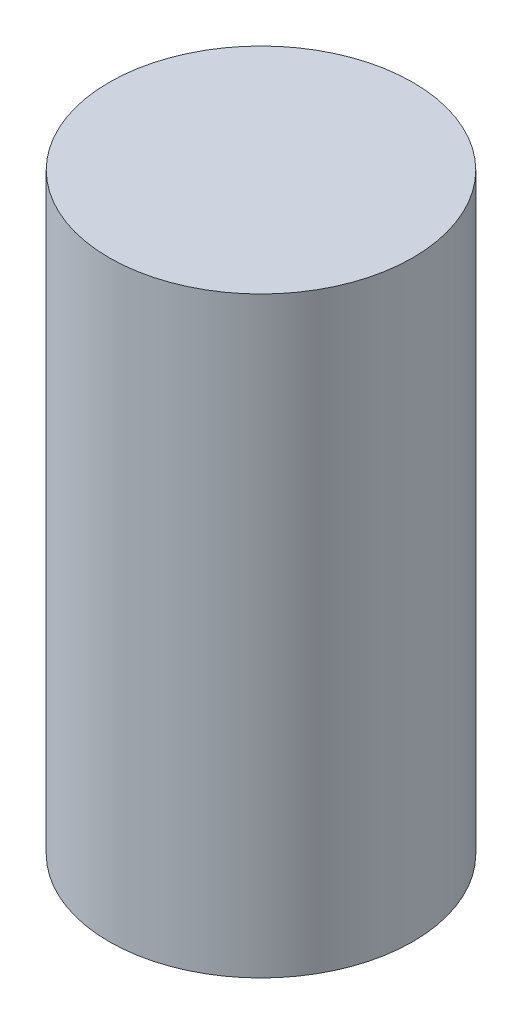
ISO-10303-21;
HEADER;
FILE_DESCRIPTION(('STEP AP214'),'2;1');
FILE_NAME('part.step','',(''),(''),'','','');
FILE_SCHEMA(('AUTOMOTIVE_DESIGN { 1 0 10303 214 1 1 1 1 }'));
ENDSEC;
DATA;
#1=APPLICATION_CONTEXT('core data for automotive mechanical design processes');
#2=APPLICATION_PROTOCOL_DEFINITION('international standard','automotive_design',2000,#1);
#3=PRODUCT_CONTEXT('',#1,'mechanical');
#4=PRODUCT('Part','Part','',(#3));
#5=PRODUCT_RELATED_PRODUCT_CATEGORY('part','',(#4));
#6=PRODUCT_DEFINITION_FORMATION('','',#4);
#7=PRODUCT_DEFINITION_CONTEXT('part definition',#1,'design');
#8=PRODUCT_DEFINITION('design','',#6,#7);
#9=PRODUCT_DEFINITION_SHAPE('','',#8);
#10=(LENGTH_UNIT() NAMED_UNIT(*) SI_UNIT(.MILLI.,.METRE.));
#11=(NAMED_UNIT(*) PLANE_ANGLE_UNIT() SI_UNIT($,.RADIAN.));
#12=(NAMED_UNIT(*) SI_UNIT($,.STERADIAN.) SOLID_ANGLE_UNIT());
#13=UNCERTAINTY_MEASURE_WITH_UNIT(LENGTH_MEASURE(1.E-05),#10,'distance_accuracy_value','');
#14=(GEOMETRIC_REPRESENTATION_CONTEXT(3) GLOBAL_UNCERTAINTY_ASSIGNED_CONTEXT((#13)) GLOBAL_UNIT_ASSIGNED_CONTEXT((#10,
#11,#12)) REPRESENTATION_CONTEXT('',''));
#15=CARTESIAN_POINT('',(0.,0.,0.));
#16=DIRECTION('',(0.,0.,1.));
#17=DIRECTION('',(1.,0.,0.));
#18=AXIS2_PLACEMENT_3D('',#15,#16,#17);
#19=CARTESIAN_POINT('',(0.,9.906,0.));
#20=DIRECTION('',(0.,-1.,0.));
#21=DIRECTION('',(0.,0.,-1.));
#22=AXIS2_PLACEMENT_3D('',#19,#20,#21);
#23=CYLINDRICAL_SURFACE('',#22,2.54);
#24=CARTESIAN_POINT('',(0.,9.906,0.));
#25=DIRECTION('',(0.,1.,0.));
#26=DIRECTION('',(0.,0.,1.));
#27=AXIS2_PLACEMENT_3D('',#24,#25,#26);
#28=CIRCLE('',#27,2.54);
#29=CARTESIAN_POINT('',(0.,9.906,2.54));
#30=VERTEX_POINT('',#29);
#31=EDGE_CURVE('E10',#30,#30,#28,.T.);
#32=ORIENTED_EDGE('',*,*,#31,.F.);
#33=EDGE_LOOP('',(#32));
#34=FACE_BOUND('',#33,.T.);
#35=CARTESIAN_POINT('',(0.,0.,0.));
#36=DIRECTION('',(0.,1.,0.));
#37=DIRECTION('',(0.,0.,1.));
#38=AXIS2_PLACEMENT_3D('',#35,#36,#37);
#39=CIRCLE('',#38,2.54);
#40=CARTESIAN_POINT('',(0.,0.,2.54));
#41=VERTEX_POINT('',#40);
#42=EDGE_CURVE('E34',#41,#41,#39,.T.);
#43=ORIENTED_EDGE('',*,*,#42,.T.);
#44=EDGE_LOOP('',(#43));
#45=FACE_BOUND('',#44,.T.);
#46=ADVANCED_FACE('F31',(#34,#45),#23,.T.);
#47=CARTESIAN_POINT('',(0.,9.906,0.));
#48=DIRECTION('',(0.,1.,0.));
#49=DIRECTION('',(0.,0.,1.));
#50=AXIS2_PLACEMENT_3D('',#47,#48,#49);
#51=PLANE('',#50);
#52=ORIENTED_EDGE('',*,*,#31,.T.);
#53=EDGE_LOOP('',(#52));
#54=FACE_BOUND('',#53,.T.);
#55=ADVANCED_FACE('F46',(#54),#51,.T.);
#56=CARTESIAN_POINT('',(0.,0.,0.));
#57=DIRECTION('',(0.,1.,0.));
#58=DIRECTION('',(0.,0.,1.));
#59=AXIS2_PLACEMENT_3D('',#56,#57,#58);
#60=PLANE('',#59);
#61=ORIENTED_EDGE('',*,*,#42,.F.);
#62=EDGE_LOOP('',(#61));
#63=FACE_BOUND('',#62,.T.);
#64=ADVANCED_FACE('F44',(#63),#60,.F.);
#65=CLOSED_SHELL('',(#46,#55,#64));
#66=MANIFOLD_SOLID_BREP('B2',#65);
#67=ADVANCED_BREP_SHAPE_REPRESENTATION('',(#18,#66),#14);
#68=SHAPE_DEFINITION_REPRESENTATION(#9,#67);
ENDSEC;
END-ISO-10303-21;
